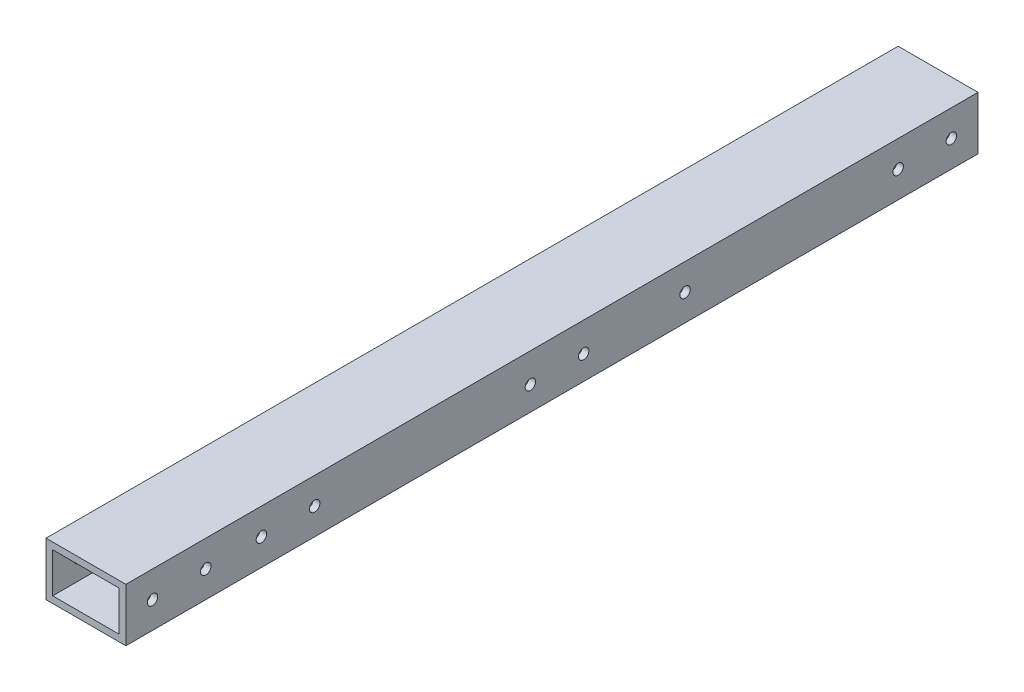
ISO-10303-21;
HEADER;
FILE_DESCRIPTION(('STEP AP214'),'2;1');
FILE_NAME('part.step','',(''),(''),'','','');
FILE_SCHEMA(('AUTOMOTIVE_DESIGN { 1 0 10303 214 1 1 1 1 }'));
ENDSEC;
DATA;
#1=APPLICATION_CONTEXT('core data for automotive mechanical design processes');
#2=APPLICATION_PROTOCOL_DEFINITION('international standard','automotive_design',2000,#1);
#3=PRODUCT_CONTEXT('',#1,'mechanical');
#4=PRODUCT('Part','Part','',(#3));
#5=PRODUCT_RELATED_PRODUCT_CATEGORY('part','',(#4));
#6=PRODUCT_DEFINITION_FORMATION('','',#4);
#7=PRODUCT_DEFINITION_CONTEXT('part definition',#1,'design');
#8=PRODUCT_DEFINITION('design','',#6,#7);
#9=PRODUCT_DEFINITION_SHAPE('','',#8);
#10=(LENGTH_UNIT() NAMED_UNIT(*) SI_UNIT(.MILLI.,.METRE.));
#11=(NAMED_UNIT(*) PLANE_ANGLE_UNIT() SI_UNIT($,.RADIAN.));
#12=(NAMED_UNIT(*) SI_UNIT($,.STERADIAN.) SOLID_ANGLE_UNIT());
#13=UNCERTAINTY_MEASURE_WITH_UNIT(LENGTH_MEASURE(1.E-05),#10,'distance_accuracy_value','');
#14=(GEOMETRIC_REPRESENTATION_CONTEXT(3) GLOBAL_UNCERTAINTY_ASSIGNED_CONTEXT((#13)) GLOBAL_UNIT_ASSIGNED_CONTEXT((#10,
#11,#12)) REPRESENTATION_CONTEXT('',''));
#15=CARTESIAN_POINT('',(0.,0.,0.));
#16=DIRECTION('',(0.,0.,1.));
#17=DIRECTION('',(1.,0.,0.));
#18=AXIS2_PLACEMENT_3D('',#15,#16,#17);
#19=CARTESIAN_POINT('',(-19.05,12.7,317.499999492));
#20=DIRECTION('',(1.,0.,0.));
#21=DIRECTION('',(0.,0.,-1.));
#22=AXIS2_PLACEMENT_3D('',#19,#20,#21);
#23=PLANE('',#22);
#24=CARTESIAN_POINT('',(-19.05,-5.03418850876514E-07,252.857000508));
#25=DIRECTION('',(1.,0.,0.));
#26=DIRECTION('',(0.,0.,-1.));
#27=AXIS2_PLACEMENT_3D('',#24,#25,#26);
#28=CIRCLE('',#27,2.48919999999998);
#29=CARTESIAN_POINT('',(-19.05,-5.03418850876514E-07,250.367800508));
#30=VERTEX_POINT('',#29);
#31=EDGE_CURVE('E310',#30,#30,#28,.T.);
#32=ORIENTED_EDGE('',*,*,#31,.T.);
#33=EDGE_LOOP('',(#32));
#34=FACE_BOUND('',#33,.T.);
#35=CARTESIAN_POINT('',(-19.05,-5.03418847407067E-07,227.457000508));
#36=DIRECTION('',(1.,0.,0.));
#37=DIRECTION('',(0.,0.,-1.));
#38=AXIS2_PLACEMENT_3D('',#35,#36,#37);
#39=CIRCLE('',#38,2.48919999999998);
#40=CARTESIAN_POINT('',(-19.05,-5.03418847407067E-07,224.967800508));
#41=VERTEX_POINT('',#40);
#42=EDGE_CURVE('E313',#41,#41,#39,.T.);
#43=ORIENTED_EDGE('',*,*,#42,.T.);
#44=EDGE_LOOP('',(#43));
#45=FACE_BOUND('',#44,.T.);
#46=CARTESIAN_POINT('',(-19.05,-1.23159570801431,99.1870005080002));
#47=DIRECTION('',(1.,0.,0.));
#48=DIRECTION('',(0.,0.,-1.));
#49=AXIS2_PLACEMENT_3D('',#46,#47,#48);
#50=CIRCLE('',#49,2.48919999999998);
#51=CARTESIAN_POINT('',(-19.05,-1.23159570801431,96.6978005080002));
#52=VERTEX_POINT('',#51);
#53=EDGE_CURVE('E201',#52,#52,#50,.T.);
#54=ORIENTED_EDGE('',*,*,#53,.T.);
#55=EDGE_LOOP('',(#54));
#56=FACE_BOUND('',#55,.T.);
#57=CARTESIAN_POINT('',(-19.05,-1.23159570801429,124.587000508));
#58=DIRECTION('',(1.,0.,0.));
#59=DIRECTION('',(0.,0.,-1.));
#60=AXIS2_PLACEMENT_3D('',#57,#58,#59);
#61=CIRCLE('',#60,2.48919999999998);
#62=CARTESIAN_POINT('',(-19.05,-1.23159570801429,122.097800508));
#63=VERTEX_POINT('',#62);
#64=EDGE_CURVE('E219',#63,#63,#61,.T.);
#65=ORIENTED_EDGE('',*,*,#64,.T.);
#66=EDGE_LOOP('',(#65));
#67=FACE_BOUND('',#66,.T.);
#68=CARTESIAN_POINT('',(-19.05,0.,-76.2));
#69=DIRECTION('',(-1.,0.,0.));
#70=DIRECTION('',(0.,0.,1.));
#71=AXIS2_PLACEMENT_3D('',#68,#69,#70);
#72=CIRCLE('',#71,2.4892);
#73=CARTESIAN_POINT('',(-19.05,0.,-73.7108));
#74=VERTEX_POINT('',#73);
#75=EDGE_CURVE('E265',#74,#74,#72,.T.);
#76=ORIENTED_EDGE('',*,*,#75,.F.);
#77=EDGE_LOOP('',(#76));
#78=FACE_BOUND('',#77,.T.);
#79=CARTESIAN_POINT('',(-19.05,0.,304.800000508));
#80=DIRECTION('',(-1.,0.,0.));
#81=DIRECTION('',(0.,0.,1.));
#82=AXIS2_PLACEMENT_3D('',#79,#80,#81);
#83=CIRCLE('',#82,2.4892);
#84=CARTESIAN_POINT('',(-19.05,0.,307.289200508));
#85=VERTEX_POINT('',#84);
#86=EDGE_CURVE('E258',#85,#85,#83,.T.);
#87=ORIENTED_EDGE('',*,*,#86,.F.);
#88=EDGE_LOOP('',(#87));
#89=FACE_BOUND('',#88,.T.);
#90=CARTESIAN_POINT('',(-19.05,0.,279.400000508));
#91=DIRECTION('',(-1.,0.,0.));
#92=DIRECTION('',(0.,0.,1.));
#93=AXIS2_PLACEMENT_3D('',#90,#91,#92);
#94=CIRCLE('',#93,2.4892);
#95=CARTESIAN_POINT('',(-19.05,0.,281.889200508));
#96=VERTEX_POINT('',#95);
#97=EDGE_CURVE('E251',#96,#96,#94,.T.);
#98=ORIENTED_EDGE('',*,*,#97,.F.);
#99=EDGE_LOOP('',(#98));
#100=FACE_BOUND('',#99,.T.);
#101=CARTESIAN_POINT('',(-19.05,0.,50.8));
#102=DIRECTION('',(-1.,0.,0.));
#103=DIRECTION('',(0.,0.,1.));
#104=AXIS2_PLACEMENT_3D('',#101,#102,#103);
#105=CIRCLE('',#104,2.48919999999999);
#106=CARTESIAN_POINT('',(-19.05,0.,53.2892));
#107=VERTEX_POINT('',#106);
#108=EDGE_CURVE('E244',#107,#107,#105,.T.);
#109=ORIENTED_EDGE('',*,*,#108,.F.);
#110=EDGE_LOOP('',(#109));
#111=FACE_BOUND('',#110,.T.);
#112=CARTESIAN_POINT('',(-19.05,0.,-50.8));
#113=DIRECTION('',(-1.,0.,0.));
#114=DIRECTION('',(0.,0.,1.));
#115=AXIS2_PLACEMENT_3D('',#112,#113,#114);
#116=CIRCLE('',#115,2.48919999999999);
#117=CARTESIAN_POINT('',(-19.05,0.,-48.3108));
#118=VERTEX_POINT('',#117);
#119=EDGE_CURVE('E237',#118,#118,#116,.T.);
#120=ORIENTED_EDGE('',*,*,#119,.F.);
#121=EDGE_LOOP('',(#120));
#122=FACE_BOUND('',#121,.T.);
#123=DIRECTION('',(0.,1.,0.));
#124=VECTOR('',#123,1.);
#125=CARTESIAN_POINT('',(-19.05,12.7,-88.899999492));
#126=LINE('',#125,#124);
#127=CARTESIAN_POINT('',(-19.05,-12.7,-88.899999492));
#128=VERTEX_POINT('',#127);
#129=CARTESIAN_POINT('',(-19.05,12.7,-88.899999492));
#130=VERTEX_POINT('',#129);
#131=EDGE_CURVE('E58',#128,#130,#126,.T.);
#132=ORIENTED_EDGE('',*,*,#131,.F.);
#133=DIRECTION('',(0.,0.,-1.));
#134=VECTOR('',#133,1.);
#135=CARTESIAN_POINT('',(-19.05,-12.7,317.499999492));
#136=LINE('',#135,#134);
#137=CARTESIAN_POINT('',(-19.05,-12.7,317.499999492));
#138=VERTEX_POINT('',#137);
#139=EDGE_CURVE('E50',#138,#128,#136,.T.);
#140=ORIENTED_EDGE('',*,*,#139,.F.);
#141=DIRECTION('',(0.,-1.,0.));
#142=VECTOR('',#141,1.);
#143=CARTESIAN_POINT('',(-19.05,12.7,317.499999492));
#144=LINE('',#143,#142);
#145=CARTESIAN_POINT('',(-19.05,12.7,317.499999492));
#146=VERTEX_POINT('',#145);
#147=EDGE_CURVE('E150',#146,#138,#144,.T.);
#148=ORIENTED_EDGE('',*,*,#147,.F.);
#149=DIRECTION('',(0.,0.,-1.));
#150=VECTOR('',#149,1.);
#151=CARTESIAN_POINT('',(-19.05,12.7,317.499999492));
#152=LINE('',#151,#150);
#153=EDGE_CURVE('E163',#146,#130,#152,.T.);
#154=ORIENTED_EDGE('',*,*,#153,.T.);
#155=EDGE_LOOP('',(#132,#140,#148,#154));
#156=FACE_BOUND('',#155,.T.);
#157=ADVANCED_FACE('F42',(#34,#45,#56,#67,#78,#89,#100,#111,#122,#156),#23,.F.);
#158=CARTESIAN_POINT('',(-19.05,-12.7,317.499999492));
#159=DIRECTION('',(0.,1.,0.));
#160=DIRECTION('',(0.,0.,1.));
#161=AXIS2_PLACEMENT_3D('',#158,#159,#160);
#162=PLANE('',#161);
#163=DIRECTION('',(-1.,0.,0.));
#164=VECTOR('',#163,1.);
#165=CARTESIAN_POINT('',(-19.05,-12.7,-88.899999492));
#166=LINE('',#165,#164);
#167=CARTESIAN_POINT('',(19.05,-12.7,-88.899999492));
#168=VERTEX_POINT('',#167);
#169=EDGE_CURVE('E65',#168,#128,#166,.T.);
#170=ORIENTED_EDGE('',*,*,#169,.F.);
#171=DIRECTION('',(0.,0.,-1.));
#172=VECTOR('',#171,1.);
#173=CARTESIAN_POINT('',(19.05,-12.7,317.499999492));
#174=LINE('',#173,#172);
#175=CARTESIAN_POINT('',(19.05,-12.7,317.499999492));
#176=VERTEX_POINT('',#175);
#177=EDGE_CURVE('E169',#176,#168,#174,.T.);
#178=ORIENTED_EDGE('',*,*,#177,.F.);
#179=DIRECTION('',(1.,0.,0.));
#180=VECTOR('',#179,1.);
#181=CARTESIAN_POINT('',(-19.05,-12.7,317.499999492));
#182=LINE('',#181,#180);
#183=EDGE_CURVE('E154',#138,#176,#182,.T.);
#184=ORIENTED_EDGE('',*,*,#183,.F.);
#185=ORIENTED_EDGE('',*,*,#139,.T.);
#186=EDGE_LOOP('',(#170,#178,#184,#185));
#187=FACE_BOUND('',#186,.T.);
#188=ADVANCED_FACE('F301',(#187),#162,.F.);
#189=CARTESIAN_POINT('',(19.05,-12.7,317.499999492));
#190=DIRECTION('',(-1.,0.,0.));
#191=DIRECTION('',(0.,-1.,0.));
#192=AXIS2_PLACEMENT_3D('',#189,#190,#191);
#193=PLANE('',#192);
#194=CARTESIAN_POINT('',(19.05,-5.03418850876514E-07,252.857000508));
#195=DIRECTION('',(1.,0.,0.));
#196=DIRECTION('',(0.,0.,-1.));
#197=AXIS2_PLACEMENT_3D('',#194,#195,#196);
#198=CIRCLE('',#197,2.48919999999999);
#199=CARTESIAN_POINT('',(19.05,-5.03418850876514E-07,250.367800508));
#200=VERTEX_POINT('',#199);
#201=EDGE_CURVE('E380',#200,#200,#198,.T.);
#202=ORIENTED_EDGE('',*,*,#201,.F.);
#203=EDGE_LOOP('',(#202));
#204=FACE_BOUND('',#203,.T.);
#205=CARTESIAN_POINT('',(19.05,-5.03418847407067E-07,227.457000508));
#206=DIRECTION('',(1.,0.,0.));
#207=DIRECTION('',(0.,0.,-1.));
#208=AXIS2_PLACEMENT_3D('',#205,#206,#207);
#209=CIRCLE('',#208,2.48919999999999);
#210=CARTESIAN_POINT('',(19.05,-5.03418847407067E-07,224.967800508));
#211=VERTEX_POINT('',#210);
#212=EDGE_CURVE('E384',#211,#211,#209,.T.);
#213=ORIENTED_EDGE('',*,*,#212,.F.);
#214=EDGE_LOOP('',(#213));
#215=FACE_BOUND('',#214,.T.);
#216=CARTESIAN_POINT('',(19.05,-1.23159570801431,99.1870005080002));
#217=DIRECTION('',(1.,0.,0.));
#218=DIRECTION('',(0.,0.,-1.));
#219=AXIS2_PLACEMENT_3D('',#216,#217,#218);
#220=CIRCLE('',#219,2.48919999999999);
#221=CARTESIAN_POINT('',(19.05,-1.23159570801431,96.6978005080002));
#222=VERTEX_POINT('',#221);
#223=EDGE_CURVE('E208',#222,#222,#220,.T.);
#224=ORIENTED_EDGE('',*,*,#223,.F.);
#225=EDGE_LOOP('',(#224));
#226=FACE_BOUND('',#225,.T.);
#227=CARTESIAN_POINT('',(19.05,-1.23159570801429,124.587000508));
#228=DIRECTION('',(1.,0.,0.));
#229=DIRECTION('',(0.,0.,-1.));
#230=AXIS2_PLACEMENT_3D('',#227,#228,#229);
#231=CIRCLE('',#230,2.48919999999999);
#232=CARTESIAN_POINT('',(19.05,-1.23159570801429,122.097800508));
#233=VERTEX_POINT('',#232);
#234=EDGE_CURVE('E205',#233,#233,#231,.T.);
#235=ORIENTED_EDGE('',*,*,#234,.F.);
#236=EDGE_LOOP('',(#235));
#237=FACE_BOUND('',#236,.T.);
#238=CARTESIAN_POINT('',(19.05,0.,-76.2));
#239=DIRECTION('',(-1.,0.,0.));
#240=DIRECTION('',(0.,0.,1.));
#241=AXIS2_PLACEMENT_3D('',#238,#239,#240);
#242=CIRCLE('',#241,2.48919999999999);
#243=CARTESIAN_POINT('',(19.05,0.,-73.7108));
#244=VERTEX_POINT('',#243);
#245=EDGE_CURVE('E178',#244,#244,#242,.T.);
#246=ORIENTED_EDGE('',*,*,#245,.T.);
#247=EDGE_LOOP('',(#246));
#248=FACE_BOUND('',#247,.T.);
#249=CARTESIAN_POINT('',(19.05,0.,304.800000508));
#250=DIRECTION('',(-1.,0.,0.));
#251=DIRECTION('',(0.,0.,1.));
#252=AXIS2_PLACEMENT_3D('',#249,#250,#251);
#253=CIRCLE('',#252,2.48919999999999);
#254=CARTESIAN_POINT('',(19.05,0.,307.289200508));
#255=VERTEX_POINT('',#254);
#256=EDGE_CURVE('E183',#255,#255,#253,.T.);
#257=ORIENTED_EDGE('',*,*,#256,.T.);
#258=EDGE_LOOP('',(#257));
#259=FACE_BOUND('',#258,.T.);
#260=CARTESIAN_POINT('',(19.05,0.,279.400000508));
#261=DIRECTION('',(-1.,0.,0.));
#262=DIRECTION('',(0.,0.,1.));
#263=AXIS2_PLACEMENT_3D('',#260,#261,#262);
#264=CIRCLE('',#263,2.48919999999999);
#265=CARTESIAN_POINT('',(19.05,0.,281.889200508));
#266=VERTEX_POINT('',#265);
#267=EDGE_CURVE('E188',#266,#266,#264,.T.);
#268=ORIENTED_EDGE('',*,*,#267,.T.);
#269=EDGE_LOOP('',(#268));
#270=FACE_BOUND('',#269,.T.);
#271=CARTESIAN_POINT('',(19.05,0.,50.8));
#272=DIRECTION('',(-1.,0.,0.));
#273=DIRECTION('',(0.,0.,1.));
#274=AXIS2_PLACEMENT_3D('',#271,#272,#273);
#275=CIRCLE('',#274,2.4892);
#276=CARTESIAN_POINT('',(19.05,0.,53.2892));
#277=VERTEX_POINT('',#276);
#278=EDGE_CURVE('E193',#277,#277,#275,.T.);
#279=ORIENTED_EDGE('',*,*,#278,.T.);
#280=EDGE_LOOP('',(#279));
#281=FACE_BOUND('',#280,.T.);
#282=CARTESIAN_POINT('',(19.05,0.,-50.8));
#283=DIRECTION('',(-1.,0.,0.));
#284=DIRECTION('',(0.,0.,1.));
#285=AXIS2_PLACEMENT_3D('',#282,#283,#284);
#286=CIRCLE('',#285,2.4892);
#287=CARTESIAN_POINT('',(19.05,0.,-48.3108));
#288=VERTEX_POINT('',#287);
#289=EDGE_CURVE('E197',#288,#288,#286,.T.);
#290=ORIENTED_EDGE('',*,*,#289,.T.);
#291=EDGE_LOOP('',(#290));
#292=FACE_BOUND('',#291,.T.);
#293=DIRECTION('',(0.,-1.,0.));
#294=VECTOR('',#293,1.);
#295=CARTESIAN_POINT('',(19.05,-12.7,-88.899999492));
#296=LINE('',#295,#294);
#297=CARTESIAN_POINT('',(19.05,12.7,-88.899999492));
#298=VERTEX_POINT('',#297);
#299=EDGE_CURVE('E232',#298,#168,#296,.T.);
#300=ORIENTED_EDGE('',*,*,#299,.F.);
#301=DIRECTION('',(0.,0.,-1.));
#302=VECTOR('',#301,1.);
#303=CARTESIAN_POINT('',(19.05,12.7,317.499999492));
#304=LINE('',#303,#302);
#305=CARTESIAN_POINT('',(19.05,12.7,317.499999492));
#306=VERTEX_POINT('',#305);
#307=EDGE_CURVE('E166',#306,#298,#304,.T.);
#308=ORIENTED_EDGE('',*,*,#307,.F.);
#309=DIRECTION('',(0.,1.,0.));
#310=VECTOR('',#309,1.);
#311=CARTESIAN_POINT('',(19.05,-12.7,317.499999492));
#312=LINE('',#311,#310);
#313=EDGE_CURVE('E157',#176,#306,#312,.T.);
#314=ORIENTED_EDGE('',*,*,#313,.F.);
#315=ORIENTED_EDGE('',*,*,#177,.T.);
#316=EDGE_LOOP('',(#300,#308,#314,#315));
#317=FACE_BOUND('',#316,.T.);
#318=ADVANCED_FACE('F306',(#204,#215,#226,#237,#248,#259,#270,#281,#292,#317),#193,.F.);
#319=CARTESIAN_POINT('',(19.05,12.7,317.499999492));
#320=DIRECTION('',(0.,-1.,0.));
#321=DIRECTION('',(0.,0.,-1.));
#322=AXIS2_PLACEMENT_3D('',#319,#320,#321);
#323=PLANE('',#322);
#324=DIRECTION('',(1.,0.,0.));
#325=VECTOR('',#324,1.);
#326=CARTESIAN_POINT('',(19.05,12.7,-88.899999492));
#327=LINE('',#326,#325);
#328=EDGE_CURVE('E127',#130,#298,#327,.T.);
#329=ORIENTED_EDGE('',*,*,#328,.F.);
#330=ORIENTED_EDGE('',*,*,#153,.F.);
#331=DIRECTION('',(-1.,0.,0.));
#332=VECTOR('',#331,1.);
#333=CARTESIAN_POINT('',(19.05,12.7,317.499999492));
#334=LINE('',#333,#332);
#335=EDGE_CURVE('E160',#306,#146,#334,.T.);
#336=ORIENTED_EDGE('',*,*,#335,.F.);
#337=ORIENTED_EDGE('',*,*,#307,.T.);
#338=EDGE_LOOP('',(#329,#330,#336,#337));
#339=FACE_BOUND('',#338,.T.);
#340=ADVANCED_FACE('F297',(#339),#323,.F.);
#341=CARTESIAN_POINT('',(-15.875,9.525,317.499999492));
#342=DIRECTION('',(1.,0.,0.));
#343=DIRECTION('',(0.,1.,0.));
#344=AXIS2_PLACEMENT_3D('',#341,#342,#343);
#345=PLANE('',#344);
#346=CARTESIAN_POINT('',(-15.875,-5.03418850876514E-07,252.857000508));
#347=DIRECTION('',(1.,0.,0.));
#348=DIRECTION('',(0.,1.,0.));
#349=AXIS2_PLACEMENT_3D('',#346,#347,#348);
#350=CIRCLE('',#349,2.48919999999999);
#351=CARTESIAN_POINT('',(-15.875,2.48919949658113,252.857000508));
#352=VERTEX_POINT('',#351);
#353=EDGE_CURVE('E593',#352,#352,#350,.T.);
#354=ORIENTED_EDGE('',*,*,#353,.F.);
#355=EDGE_LOOP('',(#354));
#356=FACE_BOUND('',#355,.T.);
#357=CARTESIAN_POINT('',(-15.875,-5.03418847407067E-07,227.457000508));
#358=DIRECTION('',(1.,0.,0.));
#359=DIRECTION('',(0.,1.,0.));
#360=AXIS2_PLACEMENT_3D('',#357,#358,#359);
#361=CIRCLE('',#360,2.48919999999999);
#362=CARTESIAN_POINT('',(-15.875,2.48919949658114,227.457000508));
#363=VERTEX_POINT('',#362);
#364=EDGE_CURVE('E213',#363,#363,#361,.T.);
#365=ORIENTED_EDGE('',*,*,#364,.F.);
#366=EDGE_LOOP('',(#365));
#367=FACE_BOUND('',#366,.T.);
#368=CARTESIAN_POINT('',(-15.875,-1.23159570801431,99.1870005080002));
#369=DIRECTION('',(1.,0.,0.));
#370=DIRECTION('',(0.,1.,0.));
#371=AXIS2_PLACEMENT_3D('',#368,#369,#370);
#372=CIRCLE('',#371,2.48919999999999);
#373=CARTESIAN_POINT('',(-15.875,1.25760429198567,99.1870005080002));
#374=VERTEX_POINT('',#373);
#375=EDGE_CURVE('E200',#374,#374,#372,.T.);
#376=ORIENTED_EDGE('',*,*,#375,.F.);
#377=EDGE_LOOP('',(#376));
#378=FACE_BOUND('',#377,.T.);
#379=CARTESIAN_POINT('',(-15.875,-1.23159570801429,124.587000508));
#380=DIRECTION('',(1.,0.,0.));
#381=DIRECTION('',(0.,1.,0.));
#382=AXIS2_PLACEMENT_3D('',#379,#380,#381);
#383=CIRCLE('',#382,2.48919999999999);
#384=CARTESIAN_POINT('',(-15.875,1.2576042919857,124.587000508));
#385=VERTEX_POINT('',#384);
#386=EDGE_CURVE('E222',#385,#385,#383,.T.);
#387=ORIENTED_EDGE('',*,*,#386,.F.);
#388=EDGE_LOOP('',(#387));
#389=FACE_BOUND('',#388,.T.);
#390=CARTESIAN_POINT('',(-15.875,0.,-50.8));
#391=DIRECTION('',(1.,0.,0.));
#392=DIRECTION('',(0.,1.,0.));
#393=AXIS2_PLACEMENT_3D('',#390,#391,#392);
#394=CIRCLE('',#393,2.48919999999999);
#395=CARTESIAN_POINT('',(-15.875,2.48919999999999,-50.8));
#396=VERTEX_POINT('',#395);
#397=EDGE_CURVE('E196',#396,#396,#394,.T.);
#398=ORIENTED_EDGE('',*,*,#397,.F.);
#399=EDGE_LOOP('',(#398));
#400=FACE_BOUND('',#399,.T.);
#401=CARTESIAN_POINT('',(-15.875,0.,50.8));
#402=DIRECTION('',(1.,0.,0.));
#403=DIRECTION('',(0.,1.,0.));
#404=AXIS2_PLACEMENT_3D('',#401,#402,#403);
#405=CIRCLE('',#404,2.48919999999999);
#406=CARTESIAN_POINT('',(-15.875,2.48919999999999,50.8));
#407=VERTEX_POINT('',#406);
#408=EDGE_CURVE('E192',#407,#407,#405,.T.);
#409=ORIENTED_EDGE('',*,*,#408,.F.);
#410=EDGE_LOOP('',(#409));
#411=FACE_BOUND('',#410,.T.);
#412=CARTESIAN_POINT('',(-15.875,0.,279.400000508));
#413=DIRECTION('',(1.,0.,0.));
#414=DIRECTION('',(0.,1.,0.));
#415=AXIS2_PLACEMENT_3D('',#412,#413,#414);
#416=CIRCLE('',#415,2.48919999999999);
#417=CARTESIAN_POINT('',(-15.875,2.48919999999999,279.400000508));
#418=VERTEX_POINT('',#417);
#419=EDGE_CURVE('E184',#418,#418,#416,.T.);
#420=ORIENTED_EDGE('',*,*,#419,.F.);
#421=EDGE_LOOP('',(#420));
#422=FACE_BOUND('',#421,.T.);
#423=CARTESIAN_POINT('',(-15.875,0.,304.800000508));
#424=DIRECTION('',(1.,0.,0.));
#425=DIRECTION('',(0.,1.,0.));
#426=AXIS2_PLACEMENT_3D('',#423,#424,#425);
#427=CIRCLE('',#426,2.48919999999999);
#428=CARTESIAN_POINT('',(-15.875,2.48919999999999,304.800000508));
#429=VERTEX_POINT('',#428);
#430=EDGE_CURVE('E182',#429,#429,#427,.T.);
#431=ORIENTED_EDGE('',*,*,#430,.F.);
#432=EDGE_LOOP('',(#431));
#433=FACE_BOUND('',#432,.T.);
#434=CARTESIAN_POINT('',(-15.875,0.,-76.2));
#435=DIRECTION('',(1.,0.,0.));
#436=DIRECTION('',(0.,1.,0.));
#437=AXIS2_PLACEMENT_3D('',#434,#435,#436);
#438=CIRCLE('',#437,2.48919999999999);
#439=CARTESIAN_POINT('',(-15.875,2.48919999999999,-76.2));
#440=VERTEX_POINT('',#439);
#441=EDGE_CURVE('E177',#440,#440,#438,.T.);
#442=ORIENTED_EDGE('',*,*,#441,.F.);
#443=EDGE_LOOP('',(#442));
#444=FACE_BOUND('',#443,.T.);
#445=DIRECTION('',(0.,0.,-1.));
#446=VECTOR('',#445,1.);
#447=CARTESIAN_POINT('',(-15.875,-9.525,317.499999492));
#448=LINE('',#447,#446);
#449=CARTESIAN_POINT('',(-15.875,-9.525,317.499999492));
#450=VERTEX_POINT('',#449);
#451=CARTESIAN_POINT('',(-15.875,-9.525,-88.899999492));
#452=VERTEX_POINT('',#451);
#453=EDGE_CURVE('E126',#450,#452,#448,.T.);
#454=ORIENTED_EDGE('',*,*,#453,.T.);
#455=DIRECTION('',(0.,1.,0.));
#456=VECTOR('',#455,1.);
#457=CARTESIAN_POINT('',(-15.875,9.525,-88.899999492));
#458=LINE('',#457,#456);
#459=CARTESIAN_POINT('',(-15.875,9.525,-88.899999492));
#460=VERTEX_POINT('',#459);
#461=EDGE_CURVE('E112',#452,#460,#458,.T.);
#462=ORIENTED_EDGE('',*,*,#461,.T.);
#463=DIRECTION('',(0.,0.,-1.));
#464=VECTOR('',#463,1.);
#465=CARTESIAN_POINT('',(-15.875,9.525,317.499999492));
#466=LINE('',#465,#464);
#467=CARTESIAN_POINT('',(-15.875,9.525,317.499999492));
#468=VERTEX_POINT('',#467);
#469=EDGE_CURVE('E123',#468,#460,#466,.T.);
#470=ORIENTED_EDGE('',*,*,#469,.F.);
#471=DIRECTION('',(0.,-1.,0.));
#472=VECTOR('',#471,1.);
#473=CARTESIAN_POINT('',(-15.875,9.525,317.499999492));
#474=LINE('',#473,#472);
#475=EDGE_CURVE('E272',#468,#450,#474,.T.);
#476=ORIENTED_EDGE('',*,*,#475,.T.);
#477=EDGE_LOOP('',(#454,#462,#470,#476));
#478=FACE_BOUND('',#477,.T.);
#479=ADVANCED_FACE('F122',(#356,#367,#378,#389,#400,#411,#422,#433,#444,#478),#345,.T.);
#480=CARTESIAN_POINT('',(-15.875,-9.525,317.499999492));
#481=DIRECTION('',(0.,1.,0.));
#482=DIRECTION('',(0.,0.,1.));
#483=AXIS2_PLACEMENT_3D('',#480,#481,#482);
#484=PLANE('',#483);
#485=DIRECTION('',(0.,0.,-1.));
#486=VECTOR('',#485,1.);
#487=CARTESIAN_POINT('',(15.875,-9.525,317.499999492));
#488=LINE('',#487,#486);
#489=CARTESIAN_POINT('',(15.875,-9.525,317.499999492));
#490=VERTEX_POINT('',#489);
#491=CARTESIAN_POINT('',(15.875,-9.525,-88.899999492));
#492=VERTEX_POINT('',#491);
#493=EDGE_CURVE('E140',#490,#492,#488,.T.);
#494=ORIENTED_EDGE('',*,*,#493,.T.);
#495=DIRECTION('',(-1.,0.,0.));
#496=VECTOR('',#495,1.);
#497=CARTESIAN_POINT('',(-15.875,-9.525,-88.899999492));
#498=LINE('',#497,#496);
#499=EDGE_CURVE('E128',#492,#452,#498,.T.);
#500=ORIENTED_EDGE('',*,*,#499,.T.);
#501=ORIENTED_EDGE('',*,*,#453,.F.);
#502=DIRECTION('',(1.,0.,0.));
#503=VECTOR('',#502,1.);
#504=CARTESIAN_POINT('',(-15.875,-9.525,317.499999492));
#505=LINE('',#504,#503);
#506=EDGE_CURVE('E275',#450,#490,#505,.T.);
#507=ORIENTED_EDGE('',*,*,#506,.T.);
#508=EDGE_LOOP('',(#494,#500,#501,#507));
#509=FACE_BOUND('',#508,.T.);
#510=ADVANCED_FACE('F288',(#509),#484,.T.);
#511=CARTESIAN_POINT('',(15.875,-9.525,317.499999492));
#512=DIRECTION('',(-1.,0.,0.));
#513=DIRECTION('',(0.,-1.,0.));
#514=AXIS2_PLACEMENT_3D('',#511,#512,#513);
#515=PLANE('',#514);
#516=CARTESIAN_POINT('',(15.875,-5.03418850876514E-07,252.857000508));
#517=DIRECTION('',(-1.,0.,0.));
#518=DIRECTION('',(0.,-1.,0.));
#519=AXIS2_PLACEMENT_3D('',#516,#517,#518);
#520=CIRCLE('',#519,2.48919999999999);
#521=CARTESIAN_POINT('',(15.875,-2.48920050341884,252.857000508));
#522=VERTEX_POINT('',#521);
#523=EDGE_CURVE('E595',#522,#522,#520,.T.);
#524=ORIENTED_EDGE('',*,*,#523,.F.);
#525=EDGE_LOOP('',(#524));
#526=FACE_BOUND('',#525,.T.);
#527=CARTESIAN_POINT('',(15.875,-5.03418847407067E-07,227.457000508));
#528=DIRECTION('',(-1.,0.,0.));
#529=DIRECTION('',(0.,-1.,0.));
#530=AXIS2_PLACEMENT_3D('',#527,#528,#529);
#531=CIRCLE('',#530,2.48919999999999);
#532=CARTESIAN_POINT('',(15.875,-2.48920050341883,227.457000508));
#533=VERTEX_POINT('',#532);
#534=EDGE_CURVE('E45',#533,#533,#531,.T.);
#535=ORIENTED_EDGE('',*,*,#534,.F.);
#536=EDGE_LOOP('',(#535));
#537=FACE_BOUND('',#536,.T.);
#538=CARTESIAN_POINT('',(15.875,-1.23159570801431,99.1870005080002));
#539=DIRECTION('',(-1.,0.,0.));
#540=DIRECTION('',(0.,-1.,0.));
#541=AXIS2_PLACEMENT_3D('',#538,#539,#540);
#542=CIRCLE('',#541,2.48919999999999);
#543=CARTESIAN_POINT('',(15.875,-3.7207957080143,99.1870005080002));
#544=VERTEX_POINT('',#543);
#545=EDGE_CURVE('E198',#544,#544,#542,.T.);
#546=ORIENTED_EDGE('',*,*,#545,.F.);
#547=EDGE_LOOP('',(#546));
#548=FACE_BOUND('',#547,.T.);
#549=CARTESIAN_POINT('',(15.875,-1.23159570801429,124.587000508));
#550=DIRECTION('',(-1.,0.,0.));
#551=DIRECTION('',(0.,-1.,0.));
#552=AXIS2_PLACEMENT_3D('',#549,#550,#551);
#553=CIRCLE('',#552,2.48919999999999);
#554=CARTESIAN_POINT('',(15.875,-3.72079570801427,124.587000508));
#555=VERTEX_POINT('',#554);
#556=EDGE_CURVE('E225',#555,#555,#553,.T.);
#557=ORIENTED_EDGE('',*,*,#556,.F.);
#558=EDGE_LOOP('',(#557));
#559=FACE_BOUND('',#558,.T.);
#560=CARTESIAN_POINT('',(15.875,0.,-50.8));
#561=DIRECTION('',(-1.,0.,0.));
#562=DIRECTION('',(0.,-1.,0.));
#563=AXIS2_PLACEMENT_3D('',#560,#561,#562);
#564=CIRCLE('',#563,2.48919999999999);
#565=CARTESIAN_POINT('',(15.875,-2.4892,-50.8));
#566=VERTEX_POINT('',#565);
#567=EDGE_CURVE('E194',#566,#566,#564,.T.);
#568=ORIENTED_EDGE('',*,*,#567,.F.);
#569=EDGE_LOOP('',(#568));
#570=FACE_BOUND('',#569,.T.);
#571=CARTESIAN_POINT('',(15.875,0.,50.8));
#572=DIRECTION('',(-1.,0.,0.));
#573=DIRECTION('',(0.,-1.,0.));
#574=AXIS2_PLACEMENT_3D('',#571,#572,#573);
#575=CIRCLE('',#574,2.48919999999999);
#576=CARTESIAN_POINT('',(15.875,-2.48919999999999,50.8));
#577=VERTEX_POINT('',#576);
#578=EDGE_CURVE('E189',#577,#577,#575,.T.);
#579=ORIENTED_EDGE('',*,*,#578,.F.);
#580=EDGE_LOOP('',(#579));
#581=FACE_BOUND('',#580,.T.);
#582=CARTESIAN_POINT('',(15.875,0.,279.400000508));
#583=DIRECTION('',(-1.,0.,0.));
#584=DIRECTION('',(0.,-1.,0.));
#585=AXIS2_PLACEMENT_3D('',#582,#583,#584);
#586=CIRCLE('',#585,2.48919999999999);
#587=CARTESIAN_POINT('',(15.875,-2.4892,279.400000508));
#588=VERTEX_POINT('',#587);
#589=EDGE_CURVE('E187',#588,#588,#586,.T.);
#590=ORIENTED_EDGE('',*,*,#589,.F.);
#591=EDGE_LOOP('',(#590));
#592=FACE_BOUND('',#591,.T.);
#593=CARTESIAN_POINT('',(15.875,0.,304.800000508));
#594=DIRECTION('',(-1.,0.,0.));
#595=DIRECTION('',(0.,-1.,0.));
#596=AXIS2_PLACEMENT_3D('',#593,#594,#595);
#597=CIRCLE('',#596,2.48919999999999);
#598=CARTESIAN_POINT('',(15.875,-2.48919999999999,304.800000508));
#599=VERTEX_POINT('',#598);
#600=EDGE_CURVE('E179',#599,#599,#597,.T.);
#601=ORIENTED_EDGE('',*,*,#600,.F.);
#602=EDGE_LOOP('',(#601));
#603=FACE_BOUND('',#602,.T.);
#604=CARTESIAN_POINT('',(15.875,0.,-76.2));
#605=DIRECTION('',(-1.,0.,0.));
#606=DIRECTION('',(0.,-1.,0.));
#607=AXIS2_PLACEMENT_3D('',#604,#605,#606);
#608=CIRCLE('',#607,2.48919999999999);
#609=CARTESIAN_POINT('',(15.875,-2.4892,-76.2));
#610=VERTEX_POINT('',#609);
#611=EDGE_CURVE('E174',#610,#610,#608,.T.);
#612=ORIENTED_EDGE('',*,*,#611,.F.);
#613=EDGE_LOOP('',(#612));
#614=FACE_BOUND('',#613,.T.);
#615=DIRECTION('',(0.,0.,-1.));
#616=VECTOR('',#615,1.);
#617=CARTESIAN_POINT('',(15.875,9.525,317.499999492));
#618=LINE('',#617,#616);
#619=CARTESIAN_POINT('',(15.875,9.525,317.499999492));
#620=VERTEX_POINT('',#619);
#621=CARTESIAN_POINT('',(15.875,9.525,-88.899999492));
#622=VERTEX_POINT('',#621);
#623=EDGE_CURVE('E134',#620,#622,#618,.T.);
#624=ORIENTED_EDGE('',*,*,#623,.T.);
#625=DIRECTION('',(0.,-1.,0.));
#626=VECTOR('',#625,1.);
#627=CARTESIAN_POINT('',(15.875,-9.525,-88.899999492));
#628=LINE('',#627,#626);
#629=EDGE_CURVE('E115',#622,#492,#628,.T.);
#630=ORIENTED_EDGE('',*,*,#629,.T.);
#631=ORIENTED_EDGE('',*,*,#493,.F.);
#632=DIRECTION('',(0.,1.,0.));
#633=VECTOR('',#632,1.);
#634=CARTESIAN_POINT('',(15.875,-9.525,317.499999492));
#635=LINE('',#634,#633);
#636=EDGE_CURVE('E143',#490,#620,#635,.T.);
#637=ORIENTED_EDGE('',*,*,#636,.T.);
#638=EDGE_LOOP('',(#624,#630,#631,#637));
#639=FACE_BOUND('',#638,.T.);
#640=ADVANCED_FACE('F283',(#526,#537,#548,#559,#570,#581,#592,#603,#614,#639),#515,.T.);
#641=CARTESIAN_POINT('',(15.875,9.525,317.499999492));
#642=DIRECTION('',(0.,-1.,0.));
#643=DIRECTION('',(0.,0.,-1.));
#644=AXIS2_PLACEMENT_3D('',#641,#642,#643);
#645=PLANE('',#644);
#646=ORIENTED_EDGE('',*,*,#469,.T.);
#647=DIRECTION('',(1.,0.,0.));
#648=VECTOR('',#647,1.);
#649=CARTESIAN_POINT('',(15.875,9.525,-88.899999492));
#650=LINE('',#649,#648);
#651=EDGE_CURVE('E12',#460,#622,#650,.T.);
#652=ORIENTED_EDGE('',*,*,#651,.T.);
#653=ORIENTED_EDGE('',*,*,#623,.F.);
#654=DIRECTION('',(-1.,0.,0.));
#655=VECTOR('',#654,1.);
#656=CARTESIAN_POINT('',(15.875,9.525,317.499999492));
#657=LINE('',#656,#655);
#658=EDGE_CURVE('E132',#620,#468,#657,.T.);
#659=ORIENTED_EDGE('',*,*,#658,.T.);
#660=EDGE_LOOP('',(#646,#652,#653,#659));
#661=FACE_BOUND('',#660,.T.);
#662=ADVANCED_FACE('F130',(#661),#645,.T.);
#663=CARTESIAN_POINT('',(0.,0.,317.499999492));
#664=DIRECTION('',(0.,0.,1.));
#665=DIRECTION('',(1.,0.,0.));
#666=AXIS2_PLACEMENT_3D('',#663,#664,#665);
#667=PLANE('',#666);
#668=ORIENTED_EDGE('',*,*,#147,.T.);
#669=ORIENTED_EDGE('',*,*,#183,.T.);
#670=ORIENTED_EDGE('',*,*,#313,.T.);
#671=ORIENTED_EDGE('',*,*,#335,.T.);
#672=EDGE_LOOP('',(#668,#669,#670,#671));
#673=FACE_BOUND('',#672,.T.);
#674=ORIENTED_EDGE('',*,*,#506,.F.);
#675=ORIENTED_EDGE('',*,*,#475,.F.);
#676=ORIENTED_EDGE('',*,*,#658,.F.);
#677=ORIENTED_EDGE('',*,*,#636,.F.);
#678=EDGE_LOOP('',(#674,#675,#676,#677));
#679=FACE_BOUND('',#678,.T.);
#680=ADVANCED_FACE('F286',(#673,#679),#667,.T.);
#681=CARTESIAN_POINT('',(-19.05,0.,-76.2));
#682=DIRECTION('',(-1.,0.,0.));
#683=DIRECTION('',(0.,0.,1.));
#684=AXIS2_PLACEMENT_3D('',#681,#682,#683);
#685=CYLINDRICAL_SURFACE('',#684,2.48919999999999);
#686=ORIENTED_EDGE('',*,*,#611,.T.);
#687=EDGE_LOOP('',(#686));
#688=FACE_BOUND('',#687,.T.);
#689=ORIENTED_EDGE('',*,*,#245,.F.);
#690=EDGE_LOOP('',(#689));
#691=FACE_BOUND('',#690,.T.);
#692=ADVANCED_FACE('F357',(#688,#691),#685,.F.);
#693=ORIENTED_EDGE('',*,*,#441,.T.);
#694=EDGE_LOOP('',(#693));
#695=FACE_BOUND('',#694,.T.);
#696=ORIENTED_EDGE('',*,*,#75,.T.);
#697=EDGE_LOOP('',(#696));
#698=FACE_BOUND('',#697,.T.);
#699=ADVANCED_FACE('F355',(#695,#698),#685,.F.);
#700=CARTESIAN_POINT('',(-19.05,0.,304.800000508));
#701=DIRECTION('',(-1.,0.,0.));
#702=DIRECTION('',(0.,0.,1.));
#703=AXIS2_PLACEMENT_3D('',#700,#701,#702);
#704=CYLINDRICAL_SURFACE('',#703,2.48919999999999);
#705=ORIENTED_EDGE('',*,*,#600,.T.);
#706=EDGE_LOOP('',(#705));
#707=FACE_BOUND('',#706,.T.);
#708=ORIENTED_EDGE('',*,*,#256,.F.);
#709=EDGE_LOOP('',(#708));
#710=FACE_BOUND('',#709,.T.);
#711=ADVANCED_FACE('F352',(#707,#710),#704,.F.);
#712=ORIENTED_EDGE('',*,*,#430,.T.);
#713=EDGE_LOOP('',(#712));
#714=FACE_BOUND('',#713,.T.);
#715=ORIENTED_EDGE('',*,*,#86,.T.);
#716=EDGE_LOOP('',(#715));
#717=FACE_BOUND('',#716,.T.);
#718=ADVANCED_FACE('F350',(#714,#717),#704,.F.);
#719=CARTESIAN_POINT('',(-19.05,0.,279.400000508));
#720=DIRECTION('',(-1.,0.,0.));
#721=DIRECTION('',(0.,0.,1.));
#722=AXIS2_PLACEMENT_3D('',#719,#720,#721);
#723=CYLINDRICAL_SURFACE('',#722,2.48919999999999);
#724=ORIENTED_EDGE('',*,*,#419,.T.);
#725=EDGE_LOOP('',(#724));
#726=FACE_BOUND('',#725,.T.);
#727=ORIENTED_EDGE('',*,*,#97,.T.);
#728=EDGE_LOOP('',(#727));
#729=FACE_BOUND('',#728,.T.);
#730=ADVANCED_FACE('F347',(#726,#729),#723,.F.);
#731=ORIENTED_EDGE('',*,*,#589,.T.);
#732=EDGE_LOOP('',(#731));
#733=FACE_BOUND('',#732,.T.);
#734=ORIENTED_EDGE('',*,*,#267,.F.);
#735=EDGE_LOOP('',(#734));
#736=FACE_BOUND('',#735,.T.);
#737=ADVANCED_FACE('F345',(#733,#736),#723,.F.);
#738=CARTESIAN_POINT('',(-19.05,0.,50.8));
#739=DIRECTION('',(-1.,0.,0.));
#740=DIRECTION('',(0.,0.,1.));
#741=AXIS2_PLACEMENT_3D('',#738,#739,#740);
#742=CYLINDRICAL_SURFACE('',#741,2.48919999999999);
#743=ORIENTED_EDGE('',*,*,#578,.T.);
#744=EDGE_LOOP('',(#743));
#745=FACE_BOUND('',#744,.T.);
#746=ORIENTED_EDGE('',*,*,#278,.F.);
#747=EDGE_LOOP('',(#746));
#748=FACE_BOUND('',#747,.T.);
#749=ADVANCED_FACE('F342',(#745,#748),#742,.F.);
#750=ORIENTED_EDGE('',*,*,#408,.T.);
#751=EDGE_LOOP('',(#750));
#752=FACE_BOUND('',#751,.T.);
#753=ORIENTED_EDGE('',*,*,#108,.T.);
#754=EDGE_LOOP('',(#753));
#755=FACE_BOUND('',#754,.T.);
#756=ADVANCED_FACE('F338',(#752,#755),#742,.F.);
#757=CARTESIAN_POINT('',(-19.05,0.,-50.8));
#758=DIRECTION('',(-1.,0.,0.));
#759=DIRECTION('',(0.,0.,1.));
#760=AXIS2_PLACEMENT_3D('',#757,#758,#759);
#761=CYLINDRICAL_SURFACE('',#760,2.48919999999999);
#762=ORIENTED_EDGE('',*,*,#567,.T.);
#763=EDGE_LOOP('',(#762));
#764=FACE_BOUND('',#763,.T.);
#765=ORIENTED_EDGE('',*,*,#289,.F.);
#766=EDGE_LOOP('',(#765));
#767=FACE_BOUND('',#766,.T.);
#768=ADVANCED_FACE('F329',(#764,#767),#761,.F.);
#769=ORIENTED_EDGE('',*,*,#397,.T.);
#770=EDGE_LOOP('',(#769));
#771=FACE_BOUND('',#770,.T.);
#772=ORIENTED_EDGE('',*,*,#119,.T.);
#773=EDGE_LOOP('',(#772));
#774=FACE_BOUND('',#773,.T.);
#775=ADVANCED_FACE('F327',(#771,#774),#761,.F.);
#776=CARTESIAN_POINT('',(0.,0.,-88.899999492));
#777=DIRECTION('',(0.,0.,-1.));
#778=DIRECTION('',(-1.,0.,0.));
#779=AXIS2_PLACEMENT_3D('',#776,#777,#778);
#780=PLANE('',#779);
#781=ORIENTED_EDGE('',*,*,#461,.F.);
#782=ORIENTED_EDGE('',*,*,#499,.F.);
#783=ORIENTED_EDGE('',*,*,#629,.F.);
#784=ORIENTED_EDGE('',*,*,#651,.F.);
#785=EDGE_LOOP('',(#781,#782,#783,#784));
#786=FACE_BOUND('',#785,.T.);
#787=ORIENTED_EDGE('',*,*,#169,.T.);
#788=ORIENTED_EDGE('',*,*,#131,.T.);
#789=ORIENTED_EDGE('',*,*,#328,.T.);
#790=ORIENTED_EDGE('',*,*,#299,.T.);
#791=EDGE_LOOP('',(#787,#788,#789,#790));
#792=FACE_BOUND('',#791,.T.);
#793=ADVANCED_FACE('F110',(#786,#792),#780,.T.);
#794=CARTESIAN_POINT('',(19.05,-1.23159570801429,124.587000508));
#795=DIRECTION('',(1.,0.,0.));
#796=DIRECTION('',(0.,0.,-1.));
#797=AXIS2_PLACEMENT_3D('',#794,#795,#796);
#798=CYLINDRICAL_SURFACE('',#797,2.48919999999999);
#799=ORIENTED_EDGE('',*,*,#556,.T.);
#800=EDGE_LOOP('',(#799));
#801=FACE_BOUND('',#800,.T.);
#802=ORIENTED_EDGE('',*,*,#234,.T.);
#803=EDGE_LOOP('',(#802));
#804=FACE_BOUND('',#803,.T.);
#805=ADVANCED_FACE('F336',(#801,#804),#798,.F.);
#806=ORIENTED_EDGE('',*,*,#386,.T.);
#807=EDGE_LOOP('',(#806));
#808=FACE_BOUND('',#807,.T.);
#809=ORIENTED_EDGE('',*,*,#64,.F.);
#810=EDGE_LOOP('',(#809));
#811=FACE_BOUND('',#810,.T.);
#812=ADVANCED_FACE('F505',(#808,#811),#798,.F.);
#813=CARTESIAN_POINT('',(19.05,-1.23159570801431,99.1870005080002));
#814=DIRECTION('',(1.,0.,0.));
#815=DIRECTION('',(0.,0.,-1.));
#816=AXIS2_PLACEMENT_3D('',#813,#814,#815);
#817=CYLINDRICAL_SURFACE('',#816,2.48919999999999);
#818=ORIENTED_EDGE('',*,*,#545,.T.);
#819=EDGE_LOOP('',(#818));
#820=FACE_BOUND('',#819,.T.);
#821=ORIENTED_EDGE('',*,*,#223,.T.);
#822=EDGE_LOOP('',(#821));
#823=FACE_BOUND('',#822,.T.);
#824=ADVANCED_FACE('F515',(#820,#823),#817,.F.);
#825=ORIENTED_EDGE('',*,*,#375,.T.);
#826=EDGE_LOOP('',(#825));
#827=FACE_BOUND('',#826,.T.);
#828=ORIENTED_EDGE('',*,*,#53,.F.);
#829=EDGE_LOOP('',(#828));
#830=FACE_BOUND('',#829,.T.);
#831=ADVANCED_FACE('F525',(#827,#830),#817,.F.);
#832=CARTESIAN_POINT('',(19.05,-5.03418847407067E-07,227.457000508));
#833=DIRECTION('',(1.,0.,0.));
#834=DIRECTION('',(0.,0.,-1.));
#835=AXIS2_PLACEMENT_3D('',#832,#833,#834);
#836=CYLINDRICAL_SURFACE('',#835,2.48919999999999);
#837=ORIENTED_EDGE('',*,*,#534,.T.);
#838=EDGE_LOOP('',(#837));
#839=FACE_BOUND('',#838,.T.);
#840=ORIENTED_EDGE('',*,*,#212,.T.);
#841=EDGE_LOOP('',(#840));
#842=FACE_BOUND('',#841,.T.);
#843=ADVANCED_FACE('F535',(#839,#842),#836,.F.);
#844=ORIENTED_EDGE('',*,*,#364,.T.);
#845=EDGE_LOOP('',(#844));
#846=FACE_BOUND('',#845,.T.);
#847=ORIENTED_EDGE('',*,*,#42,.F.);
#848=EDGE_LOOP('',(#847));
#849=FACE_BOUND('',#848,.T.);
#850=ADVANCED_FACE('F545',(#846,#849),#836,.F.);
#851=CARTESIAN_POINT('',(19.05,-5.03418850876514E-07,252.857000508));
#852=DIRECTION('',(1.,0.,0.));
#853=DIRECTION('',(0.,0.,-1.));
#854=AXIS2_PLACEMENT_3D('',#851,#852,#853);
#855=CYLINDRICAL_SURFACE('',#854,2.48919999999999);
#856=ORIENTED_EDGE('',*,*,#523,.T.);
#857=EDGE_LOOP('',(#856));
#858=FACE_BOUND('',#857,.T.);
#859=ORIENTED_EDGE('',*,*,#201,.T.);
#860=EDGE_LOOP('',(#859));
#861=FACE_BOUND('',#860,.T.);
#862=ADVANCED_FACE('F556',(#858,#861),#855,.F.);
#863=ORIENTED_EDGE('',*,*,#353,.T.);
#864=EDGE_LOOP('',(#863));
#865=FACE_BOUND('',#864,.T.);
#866=ORIENTED_EDGE('',*,*,#31,.F.);
#867=EDGE_LOOP('',(#866));
#868=FACE_BOUND('',#867,.T.);
#869=ADVANCED_FACE('F566',(#865,#868),#855,.F.);
#870=CLOSED_SHELL('',(#157,#188,#318,#340,#479,#510,#640,#662,#680,#692,#699,#711,#718,#730,
#737,#749,#756,#768,#775,#793,#805,#812,#824,#831,#843,#850,#862,#869));
#871=MANIFOLD_SOLID_BREP('B2',#870);
#872=ADVANCED_BREP_SHAPE_REPRESENTATION('',(#18,#871),#14);
#873=SHAPE_DEFINITION_REPRESENTATION(#9,#872);
ENDSEC;
END-ISO-10303-21;
